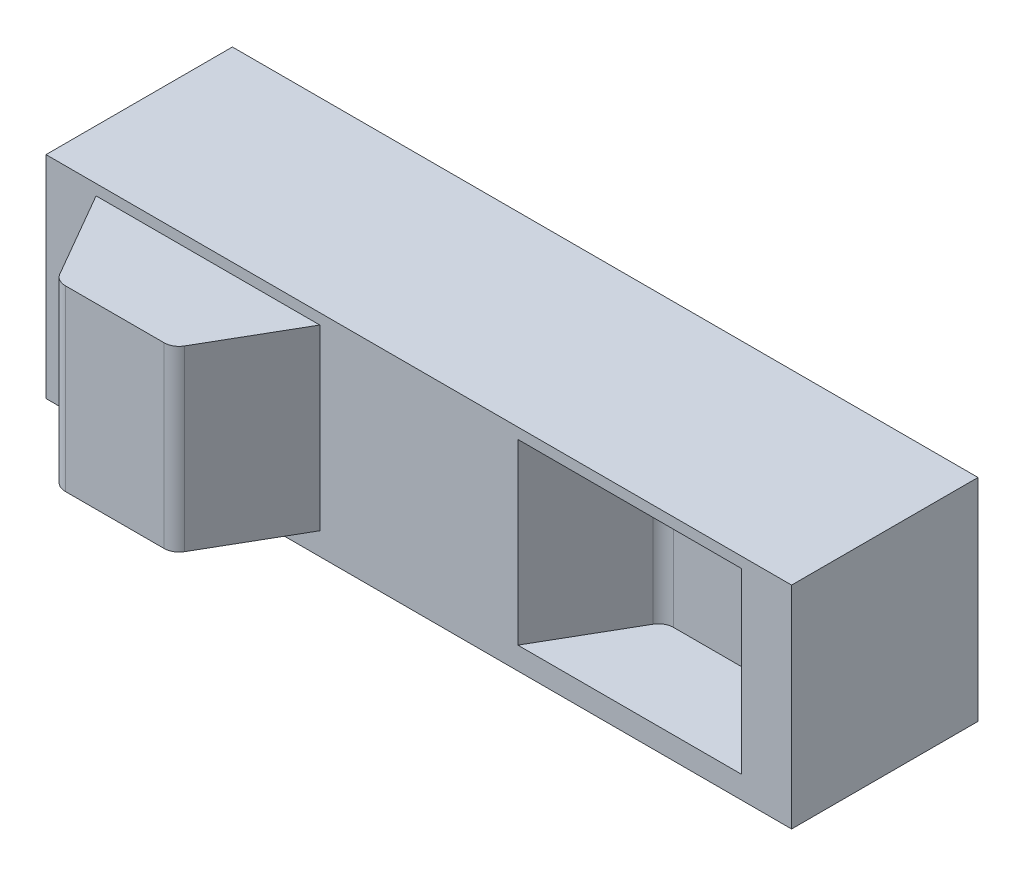
ISO-10303-21;
HEADER;
FILE_DESCRIPTION(('STEP AP214'),'2;1');
FILE_NAME('part.step','',(''),(''),'','','');
FILE_SCHEMA(('AUTOMOTIVE_DESIGN { 1 0 10303 214 1 1 1 1 }'));
ENDSEC;
DATA;
#1=APPLICATION_CONTEXT('core data for automotive mechanical design processes');
#2=APPLICATION_PROTOCOL_DEFINITION('international standard','automotive_design',2000,#1);
#3=PRODUCT_CONTEXT('',#1,'mechanical');
#4=PRODUCT('Part','Part','',(#3));
#5=PRODUCT_RELATED_PRODUCT_CATEGORY('part','',(#4));
#6=PRODUCT_DEFINITION_FORMATION('','',#4);
#7=PRODUCT_DEFINITION_CONTEXT('part definition',#1,'design');
#8=PRODUCT_DEFINITION('design','',#6,#7);
#9=PRODUCT_DEFINITION_SHAPE('','',#8);
#10=(LENGTH_UNIT() NAMED_UNIT(*) SI_UNIT(.MILLI.,.METRE.));
#11=(NAMED_UNIT(*) PLANE_ANGLE_UNIT() SI_UNIT($,.RADIAN.));
#12=(NAMED_UNIT(*) SI_UNIT($,.STERADIAN.) SOLID_ANGLE_UNIT());
#13=UNCERTAINTY_MEASURE_WITH_UNIT(LENGTH_MEASURE(1.E-05),#10,'distance_accuracy_value','');
#14=(GEOMETRIC_REPRESENTATION_CONTEXT(3) GLOBAL_UNCERTAINTY_ASSIGNED_CONTEXT((#13)) GLOBAL_UNIT_ASSIGNED_CONTEXT((#10,
#11,#12)) REPRESENTATION_CONTEXT('',''));
#15=CARTESIAN_POINT('',(0.,0.,0.));
#16=DIRECTION('',(0.,0.,1.));
#17=DIRECTION('',(1.,0.,0.));
#18=AXIS2_PLACEMENT_3D('',#15,#16,#17);
#19=CARTESIAN_POINT('',(-50.,14.1675,0.));
#20=DIRECTION('',(0.,0.,-1.));
#21=DIRECTION('',(-1.,0.,0.));
#22=AXIS2_PLACEMENT_3D('',#19,#20,#21);
#23=PLANE('',#22);
#24=DIRECTION('',(0.,1.,0.));
#25=VECTOR('',#24,1.);
#26=CARTESIAN_POINT('',(43.2833333333333,-46.6675,0.));
#27=LINE('',#26,#25);
#28=CARTESIAN_POINT('',(43.2833333333333,-11.1675,0.));
#29=VERTEX_POINT('',#28);
#30=CARTESIAN_POINT('',(43.2833333333333,12.7325,0.));
#31=VERTEX_POINT('',#30);
#32=EDGE_CURVE('E188',#29,#31,#27,.T.);
#33=ORIENTED_EDGE('',*,*,#32,.F.);
#34=DIRECTION('',(1.,0.,0.));
#35=VECTOR('',#34,1.);
#36=CARTESIAN_POINT('',(0.,-11.1675,0.));
#37=LINE('',#36,#35);
#38=CARTESIAN_POINT('',(13.2833333333333,-11.1675,0.));
#39=VERTEX_POINT('',#38);
#40=EDGE_CURVE('E182',#39,#29,#37,.T.);
#41=ORIENTED_EDGE('',*,*,#40,.F.);
#42=DIRECTION('',(0.,1.,0.));
#43=VECTOR('',#42,1.);
#44=CARTESIAN_POINT('',(13.2833333333333,-46.6675,0.));
#45=LINE('',#44,#43);
#46=CARTESIAN_POINT('',(13.2833333333333,12.7325,0.));
#47=VERTEX_POINT('',#46);
#48=EDGE_CURVE('E163',#39,#47,#45,.T.);
#49=ORIENTED_EDGE('',*,*,#48,.T.);
#50=DIRECTION('',(-1.,0.,0.));
#51=VECTOR('',#50,1.);
#52=CARTESIAN_POINT('',(0.,12.7325,0.));
#53=LINE('',#52,#51);
#54=EDGE_CURVE('E169',#31,#47,#53,.T.);
#55=ORIENTED_EDGE('',*,*,#54,.F.);
#56=EDGE_LOOP('',(#33,#41,#49,#55));
#57=FACE_BOUND('',#56,.T.);
#58=DIRECTION('',(1.,0.,0.));
#59=VECTOR('',#58,1.);
#60=CARTESIAN_POINT('',(-50.,-14.1675,0.));
#61=LINE('',#60,#59);
#62=CARTESIAN_POINT('',(-50.,-14.1675,0.));
#63=VERTEX_POINT('',#62);
#64=CARTESIAN_POINT('',(50.,-14.1675,0.));
#65=VERTEX_POINT('',#64);
#66=EDGE_CURVE('E250',#63,#65,#61,.T.);
#67=ORIENTED_EDGE('',*,*,#66,.T.);
#68=DIRECTION('',(0.,-1.,0.));
#69=VECTOR('',#68,1.);
#70=CARTESIAN_POINT('',(50.,14.1675,0.));
#71=LINE('',#70,#69);
#72=CARTESIAN_POINT('',(50.,14.1675,0.));
#73=VERTEX_POINT('',#72);
#74=EDGE_CURVE('E265',#73,#65,#71,.T.);
#75=ORIENTED_EDGE('',*,*,#74,.F.);
#76=DIRECTION('',(1.,0.,0.));
#77=VECTOR('',#76,1.);
#78=CARTESIAN_POINT('',(-50.,14.1675,0.));
#79=LINE('',#78,#77);
#80=CARTESIAN_POINT('',(-50.,14.1675,0.));
#81=VERTEX_POINT('',#80);
#82=EDGE_CURVE('E236',#81,#73,#79,.T.);
#83=ORIENTED_EDGE('',*,*,#82,.F.);
#84=DIRECTION('',(0.,-1.,0.));
#85=VECTOR('',#84,1.);
#86=CARTESIAN_POINT('',(-50.,14.1675,0.));
#87=LINE('',#86,#85);
#88=EDGE_CURVE('E269',#81,#63,#87,.T.);
#89=ORIENTED_EDGE('',*,*,#88,.T.);
#90=EDGE_LOOP('',(#67,#75,#83,#89));
#91=FACE_BOUND('',#90,.T.);
#92=DIRECTION('',(-1.,0.,0.));
#93=VECTOR('',#92,1.);
#94=CARTESIAN_POINT('',(0.,12.7325,0.));
#95=LINE('',#94,#93);
#96=CARTESIAN_POINT('',(-13.2833333333333,12.7325,0.));
#97=VERTEX_POINT('',#96);
#98=CARTESIAN_POINT('',(-43.2833333333333,12.7325,0.));
#99=VERTEX_POINT('',#98);
#100=EDGE_CURVE('E218',#97,#99,#95,.T.);
#101=ORIENTED_EDGE('',*,*,#100,.F.);
#102=DIRECTION('',(0.,-1.,0.));
#103=VECTOR('',#102,1.);
#104=CARTESIAN_POINT('',(-13.2833333333333,46.6675,0.));
#105=LINE('',#104,#103);
#106=CARTESIAN_POINT('',(-13.2833333333333,-11.1675,0.));
#107=VERTEX_POINT('',#106);
#108=EDGE_CURVE('E197',#97,#107,#105,.T.);
#109=ORIENTED_EDGE('',*,*,#108,.T.);
#110=DIRECTION('',(1.,0.,0.));
#111=VECTOR('',#110,1.);
#112=CARTESIAN_POINT('',(0.,-11.1675,0.));
#113=LINE('',#112,#111);
#114=CARTESIAN_POINT('',(-43.2833333333333,-11.1675,0.));
#115=VERTEX_POINT('',#114);
#116=EDGE_CURVE('E198',#115,#107,#113,.T.);
#117=ORIENTED_EDGE('',*,*,#116,.F.);
#118=DIRECTION('',(0.,-1.,0.));
#119=VECTOR('',#118,1.);
#120=CARTESIAN_POINT('',(-43.2833333333333,46.6675,0.));
#121=LINE('',#120,#119);
#122=EDGE_CURVE('E225',#99,#115,#121,.T.);
#123=ORIENTED_EDGE('',*,*,#122,.F.);
#124=EDGE_LOOP('',(#101,#109,#117,#123));
#125=FACE_BOUND('',#124,.T.);
#126=ADVANCED_FACE('F43',(#57,#91,#125),#23,.F.);
#127=CARTESIAN_POINT('',(-50.,14.1675,0.));
#128=DIRECTION('',(1.,0.,0.));
#129=DIRECTION('',(0.,0.,-1.));
#130=AXIS2_PLACEMENT_3D('',#127,#128,#129);
#131=PLANE('',#130);
#132=DIRECTION('',(0.,0.,1.));
#133=VECTOR('',#132,1.);
#134=CARTESIAN_POINT('',(-50.,-14.1675,0.));
#135=LINE('',#134,#133);
#136=CARTESIAN_POINT('',(-50.,-14.1675,-25.));
#137=VERTEX_POINT('',#136);
#138=EDGE_CURVE('E221',#137,#63,#135,.T.);
#139=ORIENTED_EDGE('',*,*,#138,.T.);
#140=ORIENTED_EDGE('',*,*,#88,.F.);
#141=DIRECTION('',(0.,0.,1.));
#142=VECTOR('',#141,1.);
#143=CARTESIAN_POINT('',(-50.,14.1675,0.));
#144=LINE('',#143,#142);
#145=CARTESIAN_POINT('',(-50.,14.1675,-25.));
#146=VERTEX_POINT('',#145);
#147=EDGE_CURVE('E232',#146,#81,#144,.T.);
#148=ORIENTED_EDGE('',*,*,#147,.F.);
#149=DIRECTION('',(0.,-1.,0.));
#150=VECTOR('',#149,1.);
#151=CARTESIAN_POINT('',(-50.,14.1675,-25.));
#152=LINE('',#151,#150);
#153=EDGE_CURVE('E246',#146,#137,#152,.T.);
#154=ORIENTED_EDGE('',*,*,#153,.T.);
#155=EDGE_LOOP('',(#139,#140,#148,#154));
#156=FACE_BOUND('',#155,.T.);
#157=ADVANCED_FACE('F343',(#156),#131,.F.);
#158=CARTESIAN_POINT('',(50.,14.1675,-25.));
#159=DIRECTION('',(-1.,0.,0.));
#160=DIRECTION('',(0.,0.,1.));
#161=AXIS2_PLACEMENT_3D('',#158,#159,#160);
#162=PLANE('',#161);
#163=DIRECTION('',(0.,0.,-1.));
#164=VECTOR('',#163,1.);
#165=CARTESIAN_POINT('',(50.,-14.1675,-25.));
#166=LINE('',#165,#164);
#167=CARTESIAN_POINT('',(50.,-14.1675,-25.));
#168=VERTEX_POINT('',#167);
#169=EDGE_CURVE('E253',#65,#168,#166,.T.);
#170=ORIENTED_EDGE('',*,*,#169,.T.);
#171=DIRECTION('',(0.,-1.,0.));
#172=VECTOR('',#171,1.);
#173=CARTESIAN_POINT('',(50.,14.1675,-25.));
#174=LINE('',#173,#172);
#175=CARTESIAN_POINT('',(50.,14.1675,-25.));
#176=VERTEX_POINT('',#175);
#177=EDGE_CURVE('E261',#176,#168,#174,.T.);
#178=ORIENTED_EDGE('',*,*,#177,.F.);
#179=DIRECTION('',(0.,0.,-1.));
#180=VECTOR('',#179,1.);
#181=CARTESIAN_POINT('',(50.,14.1675,-25.));
#182=LINE('',#181,#180);
#183=EDGE_CURVE('E240',#73,#176,#182,.T.);
#184=ORIENTED_EDGE('',*,*,#183,.F.);
#185=ORIENTED_EDGE('',*,*,#74,.T.);
#186=EDGE_LOOP('',(#170,#178,#184,#185));
#187=FACE_BOUND('',#186,.T.);
#188=ADVANCED_FACE('F348',(#187),#162,.F.);
#189=CARTESIAN_POINT('',(-50.,14.1675,-25.));
#190=DIRECTION('',(0.,0.,1.));
#191=DIRECTION('',(1.,0.,0.));
#192=AXIS2_PLACEMENT_3D('',#189,#190,#191);
#193=PLANE('',#192);
#194=DIRECTION('',(-1.,0.,0.));
#195=VECTOR('',#194,1.);
#196=CARTESIAN_POINT('',(-50.,-14.1675,-25.));
#197=LINE('',#196,#195);
#198=EDGE_CURVE('E237',#168,#137,#197,.T.);
#199=ORIENTED_EDGE('',*,*,#198,.T.);
#200=ORIENTED_EDGE('',*,*,#153,.F.);
#201=DIRECTION('',(-1.,0.,0.));
#202=VECTOR('',#201,1.);
#203=CARTESIAN_POINT('',(-50.,14.1675,-25.));
#204=LINE('',#203,#202);
#205=EDGE_CURVE('E243',#176,#146,#204,.T.);
#206=ORIENTED_EDGE('',*,*,#205,.F.);
#207=ORIENTED_EDGE('',*,*,#177,.T.);
#208=EDGE_LOOP('',(#199,#200,#206,#207));
#209=FACE_BOUND('',#208,.T.);
#210=ADVANCED_FACE('F409',(#209),#193,.F.);
#211=CARTESIAN_POINT('',(0.,14.1675,0.));
#212=DIRECTION('',(0.,-1.,0.));
#213=DIRECTION('',(0.,0.,-1.));
#214=AXIS2_PLACEMENT_3D('',#211,#212,#213);
#215=PLANE('',#214);
#216=ORIENTED_EDGE('',*,*,#147,.T.);
#217=ORIENTED_EDGE('',*,*,#82,.T.);
#218=ORIENTED_EDGE('',*,*,#183,.T.);
#219=ORIENTED_EDGE('',*,*,#205,.T.);
#220=EDGE_LOOP('',(#216,#217,#218,#219));
#221=FACE_BOUND('',#220,.T.);
#222=ADVANCED_FACE('F406',(#221),#215,.F.);
#223=CARTESIAN_POINT('',(0.,-14.1675,0.));
#224=DIRECTION('',(0.,-1.,0.));
#225=DIRECTION('',(0.,0.,-1.));
#226=AXIS2_PLACEMENT_3D('',#223,#224,#225);
#227=PLANE('',#226);
#228=ORIENTED_EDGE('',*,*,#138,.F.);
#229=ORIENTED_EDGE('',*,*,#198,.F.);
#230=ORIENTED_EDGE('',*,*,#169,.F.);
#231=ORIENTED_EDGE('',*,*,#66,.F.);
#232=EDGE_LOOP('',(#228,#229,#230,#231));
#233=FACE_BOUND('',#232,.T.);
#234=ADVANCED_FACE('F401',(#233),#227,.T.);
#235=CARTESIAN_POINT('',(-9.96249999999993,46.6675,-5.75185205680168));
#236=DIRECTION('',(-0.866025403784436,0.,-0.500000000000005));
#237=DIRECTION('',(-0.500000000000005,0.,0.866025403784436));
#238=AXIS2_PLACEMENT_3D('',#235,#236,#237);
#239=PLANE('',#238);
#240=DIRECTION('',(-0.500000000000005,0.,0.866025403784436));
#241=VECTOR('',#240,1.);
#242=CARTESIAN_POINT('',(-9.96249999999993,12.7325,-5.75185205680168));
#243=LINE('',#242,#241);
#244=CARTESIAN_POINT('',(-19.9228614290141,12.7325,11.5));
#245=VERTEX_POINT('',#244);
#246=EDGE_CURVE('E214',#97,#245,#243,.T.);
#247=ORIENTED_EDGE('',*,*,#246,.T.);
#248=DIRECTION('',(0.,-1.,0.));
#249=VECTOR('',#248,1.);
#250=CARTESIAN_POINT('',(-19.9228614290141,-11.1675,11.5));
#251=LINE('',#250,#249);
#252=CARTESIAN_POINT('',(-19.9228614290141,-11.1675,11.5));
#253=VERTEX_POINT('',#252);
#254=EDGE_CURVE('E295',#245,#253,#251,.T.);
#255=ORIENTED_EDGE('',*,*,#254,.T.);
#256=DIRECTION('',(0.500000000000005,0.,-0.866025403784436));
#257=VECTOR('',#256,1.);
#258=CARTESIAN_POINT('',(-9.96249999999993,-11.1675,-5.75185205680168));
#259=LINE('',#258,#257);
#260=EDGE_CURVE('E199',#253,#107,#259,.T.);
#261=ORIENTED_EDGE('',*,*,#260,.T.);
#262=ORIENTED_EDGE('',*,*,#108,.F.);
#263=EDGE_LOOP('',(#247,#255,#261,#262));
#264=FACE_BOUND('',#263,.T.);
#265=ADVANCED_FACE('F374',(#264),#239,.F.);
#266=CARTESIAN_POINT('',(0.,46.6675,12.5));
#267=DIRECTION('',(0.,0.,1.));
#268=DIRECTION('',(1.,0.,0.));
#269=AXIS2_PLACEMENT_3D('',#266,#267,#268);
#270=PLANE('',#269);
#271=DIRECTION('',(1.,0.,0.));
#272=VECTOR('',#271,1.);
#273=CARTESIAN_POINT('',(0.,12.7325,12.5));
#274=LINE('',#273,#272);
#275=CARTESIAN_POINT('',(-34.9117544300837,12.7325,12.5));
#276=VERTEX_POINT('',#275);
#277=CARTESIAN_POINT('',(-21.654912236583,12.7325,12.5));
#278=VERTEX_POINT('',#277);
#279=EDGE_CURVE('E209',#276,#278,#274,.T.);
#280=ORIENTED_EDGE('',*,*,#279,.F.);
#281=DIRECTION('',(0.,-1.,0.));
#282=VECTOR('',#281,1.);
#283=CARTESIAN_POINT('',(-34.9117544300837,46.6675,12.5));
#284=LINE('',#283,#282);
#285=CARTESIAN_POINT('',(-34.9117544300837,-11.1675,12.5));
#286=VERTEX_POINT('',#285);
#287=EDGE_CURVE('E276',#276,#286,#284,.T.);
#288=ORIENTED_EDGE('',*,*,#287,.T.);
#289=DIRECTION('',(-1.,0.,0.));
#290=VECTOR('',#289,1.);
#291=CARTESIAN_POINT('',(0.,-11.1675,12.5));
#292=LINE('',#291,#290);
#293=CARTESIAN_POINT('',(-21.654912236583,-11.1675,12.5));
#294=VERTEX_POINT('',#293);
#295=EDGE_CURVE('E193',#294,#286,#292,.T.);
#296=ORIENTED_EDGE('',*,*,#295,.F.);
#297=DIRECTION('',(0.,-1.,0.));
#298=VECTOR('',#297,1.);
#299=CARTESIAN_POINT('',(-21.654912236583,12.7325,12.5));
#300=LINE('',#299,#298);
#301=EDGE_CURVE('E273',#294,#278,#300,.F.);
#302=ORIENTED_EDGE('',*,*,#301,.T.);
#303=EDGE_LOOP('',(#280,#288,#296,#302));
#304=FACE_BOUND('',#303,.T.);
#305=ADVANCED_FACE('F388',(#304),#270,.T.);
#306=CARTESIAN_POINT('',(-32.4624999999998,46.6675,18.7422331135683));
#307=DIRECTION('',(-0.866025403784436,0.,0.500000000000005));
#308=DIRECTION('',(0.500000000000005,0.,0.866025403784436));
#309=AXIS2_PLACEMENT_3D('',#306,#307,#308);
#310=PLANE('',#309);
#311=DIRECTION('',(-0.500000000000005,0.,-0.866025403784436));
#312=VECTOR('',#311,1.);
#313=CARTESIAN_POINT('',(-32.4624999999998,-11.1675,18.7422331135683));
#314=LINE('',#313,#312);
#315=CARTESIAN_POINT('',(-36.6438052376526,-11.1675,11.5));
#316=VERTEX_POINT('',#315);
#317=EDGE_CURVE('E202',#316,#115,#314,.T.);
#318=ORIENTED_EDGE('',*,*,#317,.F.);
#319=DIRECTION('',(0.,-1.,0.));
#320=VECTOR('',#319,1.);
#321=CARTESIAN_POINT('',(-36.6438052376526,46.6675,11.5));
#322=LINE('',#321,#320);
#323=CARTESIAN_POINT('',(-36.6438052376526,12.7325,11.5));
#324=VERTEX_POINT('',#323);
#325=EDGE_CURVE('E286',#316,#324,#322,.F.);
#326=ORIENTED_EDGE('',*,*,#325,.T.);
#327=DIRECTION('',(0.500000000000005,0.,0.866025403784436));
#328=VECTOR('',#327,1.);
#329=CARTESIAN_POINT('',(-32.4624999999998,12.7325,18.7422331135683));
#330=LINE('',#329,#328);
#331=EDGE_CURVE('E213',#99,#324,#330,.T.);
#332=ORIENTED_EDGE('',*,*,#331,.F.);
#333=ORIENTED_EDGE('',*,*,#122,.T.);
#334=EDGE_LOOP('',(#318,#326,#332,#333));
#335=FACE_BOUND('',#334,.T.);
#336=ADVANCED_FACE('F384',(#335),#310,.T.);
#337=CARTESIAN_POINT('',(0.,12.7325,0.));
#338=DIRECTION('',(0.,-1.,0.));
#339=DIRECTION('',(0.,0.,-1.));
#340=AXIS2_PLACEMENT_3D('',#337,#338,#339);
#341=PLANE('',#340);
#342=ORIENTED_EDGE('',*,*,#331,.T.);
#343=CARTESIAN_POINT('',(-34.9117544300837,12.7325,10.5));
#344=DIRECTION('',(0.,-1.,0.));
#345=DIRECTION('',(0.,0.,-1.));
#346=AXIS2_PLACEMENT_3D('',#343,#344,#345);
#347=CIRCLE('',#346,2.);
#348=EDGE_CURVE('E292',#324,#276,#347,.F.);
#349=ORIENTED_EDGE('',*,*,#348,.T.);
#350=ORIENTED_EDGE('',*,*,#279,.T.);
#351=CARTESIAN_POINT('',(-21.654912236583,12.7325,10.5));
#352=DIRECTION('',(0.,-1.,0.));
#353=DIRECTION('',(0.,0.,-1.));
#354=AXIS2_PLACEMENT_3D('',#351,#352,#353);
#355=CIRCLE('',#354,2.);
#356=EDGE_CURVE('E289',#278,#245,#355,.F.);
#357=ORIENTED_EDGE('',*,*,#356,.T.);
#358=ORIENTED_EDGE('',*,*,#246,.F.);
#359=ORIENTED_EDGE('',*,*,#100,.T.);
#360=EDGE_LOOP('',(#342,#349,#350,#357,#358,#359));
#361=FACE_BOUND('',#360,.T.);
#362=ADVANCED_FACE('F370',(#361),#341,.F.);
#363=CARTESIAN_POINT('',(0.,-11.1675,0.));
#364=DIRECTION('',(0.,-1.,0.));
#365=DIRECTION('',(0.,0.,-1.));
#366=AXIS2_PLACEMENT_3D('',#363,#364,#365);
#367=PLANE('',#366);
#368=ORIENTED_EDGE('',*,*,#295,.T.);
#369=CARTESIAN_POINT('',(-34.9117544300837,-11.1675,10.5));
#370=DIRECTION('',(0.,-1.,0.));
#371=DIRECTION('',(0.,0.,-1.));
#372=AXIS2_PLACEMENT_3D('',#369,#370,#371);
#373=CIRCLE('',#372,2.);
#374=EDGE_CURVE('E283',#286,#316,#373,.T.);
#375=ORIENTED_EDGE('',*,*,#374,.T.);
#376=ORIENTED_EDGE('',*,*,#317,.T.);
#377=ORIENTED_EDGE('',*,*,#116,.T.);
#378=ORIENTED_EDGE('',*,*,#260,.F.);
#379=CARTESIAN_POINT('',(-21.654912236583,-11.1675,10.5));
#380=DIRECTION('',(0.,-1.,0.));
#381=DIRECTION('',(0.,0.,-1.));
#382=AXIS2_PLACEMENT_3D('',#379,#380,#381);
#383=CIRCLE('',#382,2.);
#384=EDGE_CURVE('E280',#253,#294,#383,.T.);
#385=ORIENTED_EDGE('',*,*,#384,.T.);
#386=EDGE_LOOP('',(#368,#375,#376,#377,#378,#385));
#387=FACE_BOUND('',#386,.T.);
#388=ADVANCED_FACE('F358',(#387),#367,.T.);
#389=CARTESIAN_POINT('',(-34.9117544300837,46.6675,10.5));
#390=DIRECTION('',(0.,-1.,0.));
#391=DIRECTION('',(0.,0.,-1.));
#392=AXIS2_PLACEMENT_3D('',#389,#390,#391);
#393=CYLINDRICAL_SURFACE('',#392,2.);
#394=ORIENTED_EDGE('',*,*,#348,.F.);
#395=ORIENTED_EDGE('',*,*,#325,.F.);
#396=ORIENTED_EDGE('',*,*,#374,.F.);
#397=ORIENTED_EDGE('',*,*,#287,.F.);
#398=EDGE_LOOP('',(#394,#395,#396,#397));
#399=FACE_BOUND('',#398,.T.);
#400=ADVANCED_FACE('F354',(#399),#393,.T.);
#401=CARTESIAN_POINT('',(-21.654912236583,46.6675,10.5));
#402=DIRECTION('',(0.,1.,0.));
#403=DIRECTION('',(0.,0.,1.));
#404=AXIS2_PLACEMENT_3D('',#401,#402,#403);
#405=CYLINDRICAL_SURFACE('',#404,2.);
#406=ORIENTED_EDGE('',*,*,#356,.F.);
#407=ORIENTED_EDGE('',*,*,#301,.F.);
#408=ORIENTED_EDGE('',*,*,#384,.F.);
#409=ORIENTED_EDGE('',*,*,#254,.F.);
#410=EDGE_LOOP('',(#406,#407,#408,#409));
#411=FACE_BOUND('',#410,.T.);
#412=ADVANCED_FACE('F357',(#411),#405,.T.);
#413=CARTESIAN_POINT('',(0.,-11.1675,0.));
#414=DIRECTION('',(0.,-1.,0.));
#415=DIRECTION('',(0.,0.,-1.));
#416=AXIS2_PLACEMENT_3D('',#413,#414,#415);
#417=PLANE('',#416);
#418=DIRECTION('',(-0.500000000000005,0.,-0.866025403784436));
#419=VECTOR('',#418,1.);
#420=CARTESIAN_POINT('',(32.4624999999998,-11.1675,-18.7422331135683));
#421=LINE('',#420,#419);
#422=CARTESIAN_POINT('',(36.6438052376525,-11.1675,-11.5));
#423=VERTEX_POINT('',#422);
#424=EDGE_CURVE('E319',#29,#423,#421,.T.);
#425=ORIENTED_EDGE('',*,*,#424,.T.);
#426=CARTESIAN_POINT('',(34.9117544300837,-11.1675,-10.5));
#427=DIRECTION('',(0.,-1.,0.));
#428=DIRECTION('',(0.,0.,-1.));
#429=AXIS2_PLACEMENT_3D('',#426,#427,#428);
#430=CIRCLE('',#429,2.);
#431=CARTESIAN_POINT('',(34.9117544300837,-11.1675,-12.5));
#432=VERTEX_POINT('',#431);
#433=EDGE_CURVE('E52',#423,#432,#430,.F.);
#434=ORIENTED_EDGE('',*,*,#433,.T.);
#435=DIRECTION('',(-1.,0.,0.));
#436=VECTOR('',#435,1.);
#437=CARTESIAN_POINT('',(0.,-11.1675,-12.5));
#438=LINE('',#437,#436);
#439=CARTESIAN_POINT('',(21.654912236583,-11.1675,-12.5));
#440=VERTEX_POINT('',#439);
#441=EDGE_CURVE('E203',#432,#440,#438,.T.);
#442=ORIENTED_EDGE('',*,*,#441,.T.);
#443=CARTESIAN_POINT('',(21.654912236583,-11.1675,-10.5));
#444=DIRECTION('',(0.,-1.,0.));
#445=DIRECTION('',(0.,0.,-1.));
#446=AXIS2_PLACEMENT_3D('',#443,#444,#445);
#447=CIRCLE('',#446,2.);
#448=CARTESIAN_POINT('',(19.9228614290141,-11.1675,-11.5));
#449=VERTEX_POINT('',#448);
#450=EDGE_CURVE('E59',#440,#449,#447,.F.);
#451=ORIENTED_EDGE('',*,*,#450,.T.);
#452=DIRECTION('',(-0.500000000000005,0.,0.866025403784436));
#453=VECTOR('',#452,1.);
#454=CARTESIAN_POINT('',(9.96249999999994,-11.1675,5.75185205680168));
#455=LINE('',#454,#453);
#456=EDGE_CURVE('E184',#449,#39,#455,.T.);
#457=ORIENTED_EDGE('',*,*,#456,.T.);
#458=ORIENTED_EDGE('',*,*,#40,.T.);
#459=EDGE_LOOP('',(#425,#434,#442,#451,#457,#458));
#460=FACE_BOUND('',#459,.T.);
#461=ADVANCED_FACE('F318',(#460),#417,.F.);
#462=CARTESIAN_POINT('',(9.96249999999994,-46.6675,5.75185205680168));
#463=DIRECTION('',(-0.866025403784436,0.,-0.500000000000005));
#464=DIRECTION('',(-0.500000000000005,0.,0.866025403784436));
#465=AXIS2_PLACEMENT_3D('',#462,#463,#464);
#466=PLANE('',#465);
#467=ORIENTED_EDGE('',*,*,#456,.F.);
#468=DIRECTION('',(0.,1.,0.));
#469=VECTOR('',#468,1.);
#470=CARTESIAN_POINT('',(19.9228614290141,12.7325,-11.5));
#471=LINE('',#470,#469);
#472=CARTESIAN_POINT('',(19.9228614290141,12.7325,-11.5));
#473=VERTEX_POINT('',#472);
#474=EDGE_CURVE('E12',#449,#473,#471,.T.);
#475=ORIENTED_EDGE('',*,*,#474,.T.);
#476=DIRECTION('',(0.500000000000005,0.,-0.866025403784436));
#477=VECTOR('',#476,1.);
#478=CARTESIAN_POINT('',(9.96249999999994,12.7325,5.75185205680168));
#479=LINE('',#478,#477);
#480=EDGE_CURVE('E159',#47,#473,#479,.T.);
#481=ORIENTED_EDGE('',*,*,#480,.F.);
#482=ORIENTED_EDGE('',*,*,#48,.F.);
#483=EDGE_LOOP('',(#467,#475,#481,#482));
#484=FACE_BOUND('',#483,.T.);
#485=ADVANCED_FACE('F161',(#484),#466,.F.);
#486=CARTESIAN_POINT('',(32.4624999999998,-46.6675,-18.7422331135683));
#487=DIRECTION('',(0.866025403784436,0.,-0.500000000000005));
#488=DIRECTION('',(-0.500000000000005,0.,-0.866025403784436));
#489=AXIS2_PLACEMENT_3D('',#486,#487,#488);
#490=PLANE('',#489);
#491=DIRECTION('',(0.500000000000005,0.,0.866025403784436));
#492=VECTOR('',#491,1.);
#493=CARTESIAN_POINT('',(32.4624999999998,12.7325,-18.7422331135683));
#494=LINE('',#493,#492);
#495=CARTESIAN_POINT('',(36.6438052376525,12.7325,-11.5));
#496=VERTEX_POINT('',#495);
#497=EDGE_CURVE('E174',#496,#31,#494,.T.);
#498=ORIENTED_EDGE('',*,*,#497,.F.);
#499=DIRECTION('',(0.,1.,0.));
#500=VECTOR('',#499,1.);
#501=CARTESIAN_POINT('',(36.6438052376525,-11.1675,-11.5));
#502=LINE('',#501,#500);
#503=EDGE_CURVE('E67',#496,#423,#502,.F.);
#504=ORIENTED_EDGE('',*,*,#503,.T.);
#505=ORIENTED_EDGE('',*,*,#424,.F.);
#506=ORIENTED_EDGE('',*,*,#32,.T.);
#507=EDGE_LOOP('',(#498,#504,#505,#506));
#508=FACE_BOUND('',#507,.T.);
#509=ADVANCED_FACE('F329',(#508),#490,.F.);
#510=CARTESIAN_POINT('',(0.,-46.6675,-12.5));
#511=DIRECTION('',(0.,0.,-1.));
#512=DIRECTION('',(-1.,0.,0.));
#513=AXIS2_PLACEMENT_3D('',#510,#511,#512);
#514=PLANE('',#513);
#515=ORIENTED_EDGE('',*,*,#441,.F.);
#516=DIRECTION('',(0.,1.,0.));
#517=VECTOR('',#516,1.);
#518=CARTESIAN_POINT('',(34.9117544300837,12.7325,-12.5));
#519=LINE('',#518,#517);
#520=CARTESIAN_POINT('',(34.9117544300837,12.7325,-12.5));
#521=VERTEX_POINT('',#520);
#522=EDGE_CURVE('E302',#432,#521,#519,.T.);
#523=ORIENTED_EDGE('',*,*,#522,.T.);
#524=DIRECTION('',(1.,0.,0.));
#525=VECTOR('',#524,1.);
#526=CARTESIAN_POINT('',(0.,12.7325,-12.5));
#527=LINE('',#526,#525);
#528=CARTESIAN_POINT('',(21.654912236583,12.7325,-12.5));
#529=VERTEX_POINT('',#528);
#530=EDGE_CURVE('E168',#529,#521,#527,.T.);
#531=ORIENTED_EDGE('',*,*,#530,.F.);
#532=DIRECTION('',(0.,1.,0.));
#533=VECTOR('',#532,1.);
#534=CARTESIAN_POINT('',(21.654912236583,-11.1675,-12.5));
#535=LINE('',#534,#533);
#536=EDGE_CURVE('E299',#529,#440,#535,.F.);
#537=ORIENTED_EDGE('',*,*,#536,.T.);
#538=EDGE_LOOP('',(#515,#523,#531,#537));
#539=FACE_BOUND('',#538,.T.);
#540=ADVANCED_FACE('F323',(#539),#514,.F.);
#541=CARTESIAN_POINT('',(0.,12.7325,0.));
#542=DIRECTION('',(0.,-1.,0.));
#543=DIRECTION('',(0.,0.,-1.));
#544=AXIS2_PLACEMENT_3D('',#541,#542,#543);
#545=PLANE('',#544);
#546=ORIENTED_EDGE('',*,*,#530,.T.);
#547=CARTESIAN_POINT('',(34.9117544300837,12.7325,-10.5));
#548=DIRECTION('',(0.,-1.,0.));
#549=DIRECTION('',(0.,0.,-1.));
#550=AXIS2_PLACEMENT_3D('',#547,#548,#549);
#551=CIRCLE('',#550,2.);
#552=EDGE_CURVE('E309',#521,#496,#551,.T.);
#553=ORIENTED_EDGE('',*,*,#552,.T.);
#554=ORIENTED_EDGE('',*,*,#497,.T.);
#555=ORIENTED_EDGE('',*,*,#54,.T.);
#556=ORIENTED_EDGE('',*,*,#480,.T.);
#557=CARTESIAN_POINT('',(21.654912236583,12.7325,-10.5));
#558=DIRECTION('',(0.,-1.,0.));
#559=DIRECTION('',(0.,0.,-1.));
#560=AXIS2_PLACEMENT_3D('',#557,#558,#559);
#561=CIRCLE('',#560,2.);
#562=EDGE_CURVE('E306',#473,#529,#561,.T.);
#563=ORIENTED_EDGE('',*,*,#562,.T.);
#564=EDGE_LOOP('',(#546,#553,#554,#555,#556,#563));
#565=FACE_BOUND('',#564,.T.);
#566=ADVANCED_FACE('F173',(#565),#545,.T.);
#567=CARTESIAN_POINT('',(34.9117544300837,-46.6675,-10.5));
#568=DIRECTION('',(0.,-1.,0.));
#569=DIRECTION('',(0.,0.,-1.));
#570=AXIS2_PLACEMENT_3D('',#567,#568,#569);
#571=CYLINDRICAL_SURFACE('',#570,2.);
#572=ORIENTED_EDGE('',*,*,#433,.F.);
#573=ORIENTED_EDGE('',*,*,#503,.F.);
#574=ORIENTED_EDGE('',*,*,#552,.F.);
#575=ORIENTED_EDGE('',*,*,#522,.F.);
#576=EDGE_LOOP('',(#572,#573,#574,#575));
#577=FACE_BOUND('',#576,.T.);
#578=ADVANCED_FACE('F328',(#577),#571,.F.);
#579=CARTESIAN_POINT('',(21.654912236583,-46.6675,-10.5));
#580=DIRECTION('',(0.,-1.,0.));
#581=DIRECTION('',(0.,0.,-1.));
#582=AXIS2_PLACEMENT_3D('',#579,#580,#581);
#583=CYLINDRICAL_SURFACE('',#582,2.);
#584=ORIENTED_EDGE('',*,*,#450,.F.);
#585=ORIENTED_EDGE('',*,*,#536,.F.);
#586=ORIENTED_EDGE('',*,*,#562,.F.);
#587=ORIENTED_EDGE('',*,*,#474,.F.);
#588=EDGE_LOOP('',(#584,#585,#586,#587));
#589=FACE_BOUND('',#588,.T.);
#590=ADVANCED_FACE('F45',(#589),#583,.F.);
#591=CLOSED_SHELL('',(#126,#157,#188,#210,#222,#234,#265,#305,#336,#362,#388,#400,#412,#461,
#485,#509,#540,#566,#578,#590));
#592=MANIFOLD_SOLID_BREP('B2',#591);
#593=ADVANCED_BREP_SHAPE_REPRESENTATION('',(#18,#592),#14);
#594=SHAPE_DEFINITION_REPRESENTATION(#9,#593);
ENDSEC;
END-ISO-10303-21;
